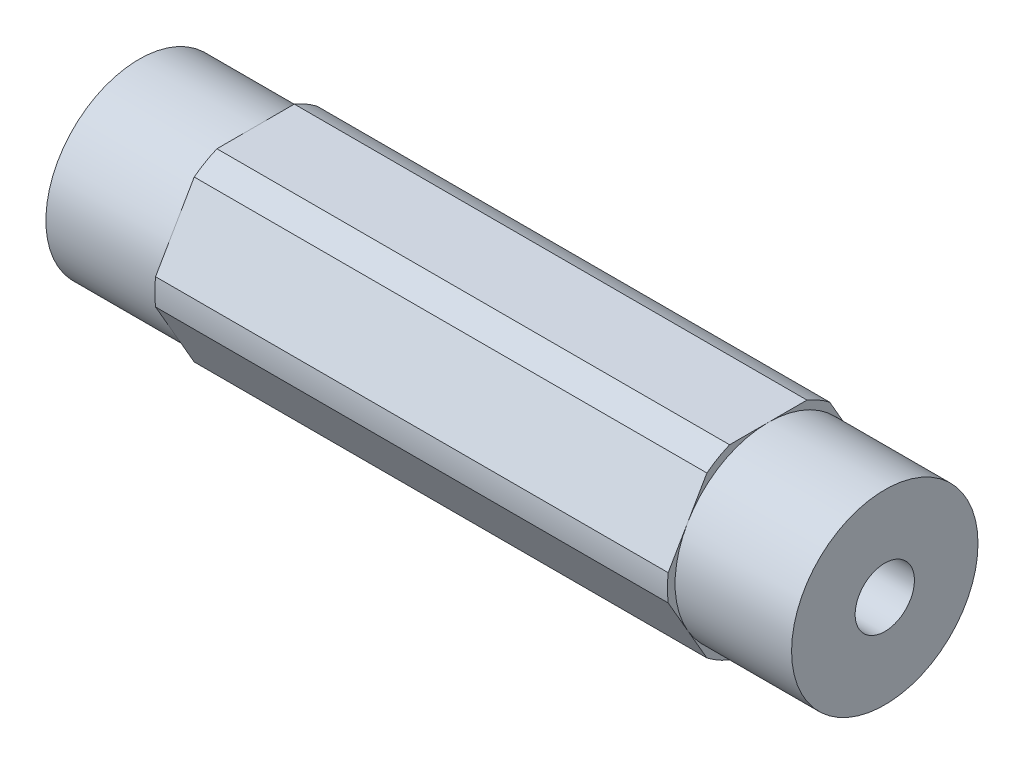
ISO-10303-21;
HEADER;
FILE_DESCRIPTION(('STEP AP214'),'2;1');
FILE_NAME('part.step','',(''),(''),'','','');
FILE_SCHEMA(('AUTOMOTIVE_DESIGN { 1 0 10303 214 1 1 1 1 }'));
ENDSEC;
DATA;
#1=APPLICATION_CONTEXT('core data for automotive mechanical design processes');
#2=APPLICATION_PROTOCOL_DEFINITION('international standard','automotive_design',2000,#1);
#3=PRODUCT_CONTEXT('',#1,'mechanical');
#4=PRODUCT('Part','Part','',(#3));
#5=PRODUCT_RELATED_PRODUCT_CATEGORY('part','',(#4));
#6=PRODUCT_DEFINITION_FORMATION('','',#4);
#7=PRODUCT_DEFINITION_CONTEXT('part definition',#1,'design');
#8=PRODUCT_DEFINITION('design','',#6,#7);
#9=PRODUCT_DEFINITION_SHAPE('','',#8);
#10=(LENGTH_UNIT() NAMED_UNIT(*) SI_UNIT(.MILLI.,.METRE.));
#11=(NAMED_UNIT(*) PLANE_ANGLE_UNIT() SI_UNIT($,.RADIAN.));
#12=(NAMED_UNIT(*) SI_UNIT($,.STERADIAN.) SOLID_ANGLE_UNIT());
#13=UNCERTAINTY_MEASURE_WITH_UNIT(LENGTH_MEASURE(1.E-05),#10,'distance_accuracy_value','');
#14=(GEOMETRIC_REPRESENTATION_CONTEXT(3) GLOBAL_UNCERTAINTY_ASSIGNED_CONTEXT((#13)) GLOBAL_UNIT_ASSIGNED_CONTEXT((#10,
#11,#12)) REPRESENTATION_CONTEXT('',''));
#15=CARTESIAN_POINT('',(0.,0.,0.));
#16=DIRECTION('',(0.,0.,1.));
#17=DIRECTION('',(1.,0.,0.));
#18=AXIS2_PLACEMENT_3D('',#15,#16,#17);
#19=CARTESIAN_POINT('',(-25.4,0.,0.));
#20=DIRECTION('',(1.,0.,0.));
#21=DIRECTION('',(0.,0.,-1.));
#22=AXIS2_PLACEMENT_3D('',#19,#20,#21);
#23=PLANE('',#22);
#24=CARTESIAN_POINT('',(-25.4,0.,0.));
#25=DIRECTION('',(1.,0.,0.));
#26=DIRECTION('',(0.,0.,-1.));
#27=AXIS2_PLACEMENT_3D('',#24,#25,#26);
#28=CIRCLE('',#27,2.0193);
#29=CARTESIAN_POINT('',(-25.4,0.,-2.0193));
#30=VERTEX_POINT('',#29);
#31=EDGE_CURVE('E251',#30,#30,#28,.T.);
#32=ORIENTED_EDGE('',*,*,#31,.T.);
#33=EDGE_LOOP('',(#32));
#34=FACE_BOUND('',#33,.T.);
#35=CARTESIAN_POINT('',(-25.4,0.,0.));
#36=DIRECTION('',(1.,0.,0.));
#37=DIRECTION('',(0.,0.,-1.));
#38=AXIS2_PLACEMENT_3D('',#35,#36,#37);
#39=CIRCLE('',#38,6.35);
#40=CARTESIAN_POINT('',(-25.4,0.,-6.35));
#41=VERTEX_POINT('',#40);
#42=EDGE_CURVE('E61',#41,#41,#39,.F.);
#43=ORIENTED_EDGE('',*,*,#42,.T.);
#44=EDGE_LOOP('',(#43));
#45=FACE_BOUND('',#44,.T.);
#46=ADVANCED_FACE('F53',(#34,#45),#23,.F.);
#47=CARTESIAN_POINT('',(25.4,3.175,-5.49926131403119));
#48=DIRECTION('',(0.,-0.5,0.866025403784438));
#49=DIRECTION('',(0.,-0.866025403784438,-0.5));
#50=AXIS2_PLACEMENT_3D('',#47,#48,#49);
#51=PLANE('',#50);
#52=DIRECTION('',(-1.,0.,0.));
#53=VECTOR('',#52,1.);
#54=CARTESIAN_POINT('',(25.4,0.893039571032185,-6.81675178197583));
#55=LINE('',#54,#53);
#56=CARTESIAN_POINT('',(17.4625,0.893039571032185,-6.81675178197583));
#57=VERTEX_POINT('',#56);
#58=CARTESIAN_POINT('',(-17.4625,0.893039571032185,-6.81675178197583));
#59=VERTEX_POINT('',#58);
#60=EDGE_CURVE('E210',#57,#59,#55,.T.);
#61=ORIENTED_EDGE('',*,*,#60,.T.);
#62=DIRECTION('',(0.,0.866025403784438,0.5));
#63=VECTOR('',#62,1.);
#64=CARTESIAN_POINT('',(-17.4625,3.175,-5.49926131403119));
#65=LINE('',#64,#63);
#66=CARTESIAN_POINT('',(-17.4625,3.175,-5.49926131403119));
#67=VERTEX_POINT('',#66);
#68=EDGE_CURVE('E68',#59,#67,#65,.T.);
#69=ORIENTED_EDGE('',*,*,#68,.T.);
#70=CARTESIAN_POINT('',(-17.4625,5.45696042896782,-4.18177084608654));
#71=VERTEX_POINT('',#70);
#72=EDGE_CURVE('E179',#67,#71,#65,.T.);
#73=ORIENTED_EDGE('',*,*,#72,.T.);
#74=DIRECTION('',(-1.,0.,0.));
#75=VECTOR('',#74,1.);
#76=CARTESIAN_POINT('',(25.4,5.45696042896782,-4.18177084608654));
#77=LINE('',#76,#75);
#78=CARTESIAN_POINT('',(17.4625,5.45696042896782,-4.18177084608654));
#79=VERTEX_POINT('',#78);
#80=EDGE_CURVE('E285',#79,#71,#77,.T.);
#81=ORIENTED_EDGE('',*,*,#80,.F.);
#82=DIRECTION('',(0.,0.866025403784438,0.5));
#83=VECTOR('',#82,1.);
#84=CARTESIAN_POINT('',(17.4625,3.175,-5.49926131403119));
#85=LINE('',#84,#83);
#86=CARTESIAN_POINT('',(17.4625,3.175,-5.49926131403119));
#87=VERTEX_POINT('',#86);
#88=EDGE_CURVE('E245',#87,#79,#85,.T.);
#89=ORIENTED_EDGE('',*,*,#88,.F.);
#90=EDGE_CURVE('E247',#57,#87,#85,.T.);
#91=ORIENTED_EDGE('',*,*,#90,.F.);
#92=EDGE_LOOP('',(#61,#69,#73,#81,#89,#91));
#93=FACE_BOUND('',#92,.T.);
#94=ADVANCED_FACE('F207',(#93),#51,.F.);
#95=CARTESIAN_POINT('',(25.4,0.,0.));
#96=DIRECTION('',(-1.,0.,0.));
#97=DIRECTION('',(0.,0.,1.));
#98=AXIS2_PLACEMENT_3D('',#95,#96,#97);
#99=CYLINDRICAL_SURFACE('',#98,6.874999966);
#100=ORIENTED_EDGE('',*,*,#80,.T.);
#101=CARTESIAN_POINT('',(-17.4625,0.,0.));
#102=DIRECTION('',(1.,0.,0.));
#103=DIRECTION('',(0.,0.,-1.));
#104=AXIS2_PLACEMENT_3D('',#101,#102,#103);
#105=CIRCLE('',#104,6.874999966);
#106=CARTESIAN_POINT('',(-17.4625,6.35,-2.63498093588929));
#107=VERTEX_POINT('',#106);
#108=EDGE_CURVE('E185',#71,#107,#105,.T.);
#109=ORIENTED_EDGE('',*,*,#108,.T.);
#110=DIRECTION('',(-1.,0.,0.));
#111=VECTOR('',#110,1.);
#112=CARTESIAN_POINT('',(25.4,6.35,-2.63498093588929));
#113=LINE('',#112,#111);
#114=CARTESIAN_POINT('',(17.4625,6.35,-2.63498093588929));
#115=VERTEX_POINT('',#114);
#116=EDGE_CURVE('E282',#115,#107,#113,.T.);
#117=ORIENTED_EDGE('',*,*,#116,.F.);
#118=CARTESIAN_POINT('',(17.4625,0.,0.));
#119=DIRECTION('',(1.,0.,0.));
#120=DIRECTION('',(0.,0.,-1.));
#121=AXIS2_PLACEMENT_3D('',#118,#119,#120);
#122=CIRCLE('',#121,6.874999966);
#123=EDGE_CURVE('E243',#79,#115,#122,.T.);
#124=ORIENTED_EDGE('',*,*,#123,.F.);
#125=EDGE_LOOP('',(#100,#109,#117,#124));
#126=FACE_BOUND('',#125,.T.);
#127=ADVANCED_FACE('F309',(#126),#99,.T.);
#128=CARTESIAN_POINT('',(25.4,6.35,0.));
#129=DIRECTION('',(0.,-1.,0.));
#130=DIRECTION('',(0.,0.,-1.));
#131=AXIS2_PLACEMENT_3D('',#128,#129,#130);
#132=PLANE('',#131);
#133=ORIENTED_EDGE('',*,*,#116,.T.);
#134=DIRECTION('',(0.,0.,1.));
#135=VECTOR('',#134,1.);
#136=CARTESIAN_POINT('',(-17.4625,6.35,0.));
#137=LINE('',#136,#135);
#138=CARTESIAN_POINT('',(-17.4625,6.35,0.));
#139=VERTEX_POINT('',#138);
#140=EDGE_CURVE('E348',#107,#139,#137,.T.);
#141=ORIENTED_EDGE('',*,*,#140,.T.);
#142=CARTESIAN_POINT('',(-17.4625,6.35,2.63498093588929));
#143=VERTEX_POINT('',#142);
#144=EDGE_CURVE('E351',#139,#143,#137,.T.);
#145=ORIENTED_EDGE('',*,*,#144,.T.);
#146=DIRECTION('',(-1.,0.,0.));
#147=VECTOR('',#146,1.);
#148=CARTESIAN_POINT('',(25.4,6.35,2.63498093588929));
#149=LINE('',#148,#147);
#150=CARTESIAN_POINT('',(17.4625,6.35,2.63498093588929));
#151=VERTEX_POINT('',#150);
#152=EDGE_CURVE('E279',#151,#143,#149,.T.);
#153=ORIENTED_EDGE('',*,*,#152,.F.);
#154=DIRECTION('',(0.,0.,1.));
#155=VECTOR('',#154,1.);
#156=CARTESIAN_POINT('',(17.4625,6.35,0.));
#157=LINE('',#156,#155);
#158=CARTESIAN_POINT('',(17.4625,6.35,0.));
#159=VERTEX_POINT('',#158);
#160=EDGE_CURVE('E240',#159,#151,#157,.T.);
#161=ORIENTED_EDGE('',*,*,#160,.F.);
#162=EDGE_CURVE('E242',#115,#159,#157,.T.);
#163=ORIENTED_EDGE('',*,*,#162,.F.);
#164=EDGE_LOOP('',(#133,#141,#145,#153,#161,#163));
#165=FACE_BOUND('',#164,.T.);
#166=ADVANCED_FACE('F316',(#165),#132,.F.);
#167=ORIENTED_EDGE('',*,*,#152,.T.);
#168=CARTESIAN_POINT('',(-17.4625,0.,0.));
#169=DIRECTION('',(1.,0.,0.));
#170=DIRECTION('',(0.,0.,-1.));
#171=AXIS2_PLACEMENT_3D('',#168,#169,#170);
#172=CIRCLE('',#171,6.874999966);
#173=CARTESIAN_POINT('',(-17.4625,5.45696042896782,4.18177084608655));
#174=VERTEX_POINT('',#173);
#175=EDGE_CURVE('E352',#143,#174,#172,.T.);
#176=ORIENTED_EDGE('',*,*,#175,.T.);
#177=DIRECTION('',(-1.,0.,0.));
#178=VECTOR('',#177,1.);
#179=CARTESIAN_POINT('',(25.4,5.45696042896782,4.18177084608655));
#180=LINE('',#179,#178);
#181=CARTESIAN_POINT('',(17.4625,5.45696042896782,4.18177084608655));
#182=VERTEX_POINT('',#181);
#183=EDGE_CURVE('E276',#182,#174,#180,.T.);
#184=ORIENTED_EDGE('',*,*,#183,.F.);
#185=CARTESIAN_POINT('',(17.4625,0.,0.));
#186=DIRECTION('',(1.,0.,0.));
#187=DIRECTION('',(0.,0.,-1.));
#188=AXIS2_PLACEMENT_3D('',#185,#186,#187);
#189=CIRCLE('',#188,6.874999966);
#190=EDGE_CURVE('E238',#151,#182,#189,.T.);
#191=ORIENTED_EDGE('',*,*,#190,.F.);
#192=EDGE_LOOP('',(#167,#176,#184,#191));
#193=FACE_BOUND('',#192,.T.);
#194=ADVANCED_FACE('F318',(#193),#99,.T.);
#195=CARTESIAN_POINT('',(25.4,3.175,5.49926131403119));
#196=DIRECTION('',(0.,-0.5,-0.866025403784439));
#197=DIRECTION('',(0.,0.866025403784439,-0.5));
#198=AXIS2_PLACEMENT_3D('',#195,#196,#197);
#199=PLANE('',#198);
#200=ORIENTED_EDGE('',*,*,#183,.T.);
#201=DIRECTION('',(0.,-0.866025403784439,0.5));
#202=VECTOR('',#201,1.);
#203=CARTESIAN_POINT('',(-17.4625,3.175,5.49926131403119));
#204=LINE('',#203,#202);
#205=CARTESIAN_POINT('',(-17.4625,3.175,5.49926131403119));
#206=VERTEX_POINT('',#205);
#207=EDGE_CURVE('E356',#174,#206,#204,.T.);
#208=ORIENTED_EDGE('',*,*,#207,.T.);
#209=CARTESIAN_POINT('',(-17.4625,0.893039571032186,6.81675178197583));
#210=VERTEX_POINT('',#209);
#211=EDGE_CURVE('E357',#206,#210,#204,.T.);
#212=ORIENTED_EDGE('',*,*,#211,.T.);
#213=DIRECTION('',(-1.,0.,0.));
#214=VECTOR('',#213,1.);
#215=CARTESIAN_POINT('',(25.4,0.893039571032186,6.81675178197583));
#216=LINE('',#215,#214);
#217=CARTESIAN_POINT('',(17.4625,0.893039571032186,6.81675178197583));
#218=VERTEX_POINT('',#217);
#219=EDGE_CURVE('E273',#218,#210,#216,.T.);
#220=ORIENTED_EDGE('',*,*,#219,.F.);
#221=DIRECTION('',(0.,-0.866025403784439,0.5));
#222=VECTOR('',#221,1.);
#223=CARTESIAN_POINT('',(17.4625,3.175,5.49926131403119));
#224=LINE('',#223,#222);
#225=CARTESIAN_POINT('',(17.4625,3.175,5.49926131403119));
#226=VERTEX_POINT('',#225);
#227=EDGE_CURVE('E235',#226,#218,#224,.T.);
#228=ORIENTED_EDGE('',*,*,#227,.F.);
#229=EDGE_CURVE('E237',#182,#226,#224,.T.);
#230=ORIENTED_EDGE('',*,*,#229,.F.);
#231=EDGE_LOOP('',(#200,#208,#212,#220,#228,#230));
#232=FACE_BOUND('',#231,.T.);
#233=ADVANCED_FACE('F335',(#232),#199,.F.);
#234=ORIENTED_EDGE('',*,*,#219,.T.);
#235=CARTESIAN_POINT('',(-17.4625,0.,0.));
#236=DIRECTION('',(1.,0.,0.));
#237=DIRECTION('',(0.,0.,-1.));
#238=AXIS2_PLACEMENT_3D('',#235,#236,#237);
#239=CIRCLE('',#238,6.874999966);
#240=CARTESIAN_POINT('',(-17.4625,-0.893039571032186,6.81675178197583));
#241=VERTEX_POINT('',#240);
#242=EDGE_CURVE('E360',#210,#241,#239,.T.);
#243=ORIENTED_EDGE('',*,*,#242,.T.);
#244=DIRECTION('',(-1.,0.,0.));
#245=VECTOR('',#244,1.);
#246=CARTESIAN_POINT('',(25.4,-0.893039571032186,6.81675178197583));
#247=LINE('',#246,#245);
#248=CARTESIAN_POINT('',(17.4625,-0.893039571032186,6.81675178197583));
#249=VERTEX_POINT('',#248);
#250=EDGE_CURVE('E270',#249,#241,#247,.T.);
#251=ORIENTED_EDGE('',*,*,#250,.F.);
#252=CARTESIAN_POINT('',(17.4625,0.,0.));
#253=DIRECTION('',(1.,0.,0.));
#254=DIRECTION('',(0.,0.,-1.));
#255=AXIS2_PLACEMENT_3D('',#252,#253,#254);
#256=CIRCLE('',#255,6.874999966);
#257=EDGE_CURVE('E233',#218,#249,#256,.T.);
#258=ORIENTED_EDGE('',*,*,#257,.F.);
#259=EDGE_LOOP('',(#234,#243,#251,#258));
#260=FACE_BOUND('',#259,.T.);
#261=ADVANCED_FACE('F333',(#260),#99,.T.);
#262=CARTESIAN_POINT('',(25.4,-3.175,5.49926131403119));
#263=DIRECTION('',(0.,0.5,-0.866025403784439));
#264=DIRECTION('',(0.,0.866025403784439,0.5));
#265=AXIS2_PLACEMENT_3D('',#262,#263,#264);
#266=PLANE('',#265);
#267=ORIENTED_EDGE('',*,*,#250,.T.);
#268=DIRECTION('',(0.,-0.866025403784439,-0.5));
#269=VECTOR('',#268,1.);
#270=CARTESIAN_POINT('',(-17.4625,-3.175,5.49926131403119));
#271=LINE('',#270,#269);
#272=CARTESIAN_POINT('',(-17.4625,-3.175,5.49926131403119));
#273=VERTEX_POINT('',#272);
#274=EDGE_CURVE('E363',#241,#273,#271,.T.);
#275=ORIENTED_EDGE('',*,*,#274,.T.);
#276=CARTESIAN_POINT('',(-17.4625,-5.45696042896782,4.18177084608654));
#277=VERTEX_POINT('',#276);
#278=EDGE_CURVE('E364',#273,#277,#271,.T.);
#279=ORIENTED_EDGE('',*,*,#278,.T.);
#280=DIRECTION('',(-1.,0.,0.));
#281=VECTOR('',#280,1.);
#282=CARTESIAN_POINT('',(25.4,-5.45696042896782,4.18177084608655));
#283=LINE('',#282,#281);
#284=CARTESIAN_POINT('',(17.4625,-5.45696042896782,4.18177084608654));
#285=VERTEX_POINT('',#284);
#286=EDGE_CURVE('E267',#285,#277,#283,.T.);
#287=ORIENTED_EDGE('',*,*,#286,.F.);
#288=DIRECTION('',(0.,-0.866025403784439,-0.5));
#289=VECTOR('',#288,1.);
#290=CARTESIAN_POINT('',(17.4625,-3.175,5.49926131403119));
#291=LINE('',#290,#289);
#292=CARTESIAN_POINT('',(17.4625,-3.175,5.49926131403119));
#293=VERTEX_POINT('',#292);
#294=EDGE_CURVE('E230',#293,#285,#291,.T.);
#295=ORIENTED_EDGE('',*,*,#294,.F.);
#296=EDGE_CURVE('E232',#249,#293,#291,.T.);
#297=ORIENTED_EDGE('',*,*,#296,.F.);
#298=EDGE_LOOP('',(#267,#275,#279,#287,#295,#297));
#299=FACE_BOUND('',#298,.T.);
#300=ADVANCED_FACE('F330',(#299),#266,.F.);
#301=ORIENTED_EDGE('',*,*,#286,.T.);
#302=CARTESIAN_POINT('',(-17.4625,0.,0.));
#303=DIRECTION('',(1.,0.,0.));
#304=DIRECTION('',(0.,0.,-1.));
#305=AXIS2_PLACEMENT_3D('',#302,#303,#304);
#306=CIRCLE('',#305,6.874999966);
#307=CARTESIAN_POINT('',(-17.4625,-6.35,2.63498093588928));
#308=VERTEX_POINT('',#307);
#309=EDGE_CURVE('E367',#277,#308,#306,.T.);
#310=ORIENTED_EDGE('',*,*,#309,.T.);
#311=DIRECTION('',(-1.,0.,0.));
#312=VECTOR('',#311,1.);
#313=CARTESIAN_POINT('',(25.4,-6.35,2.63498093588928));
#314=LINE('',#313,#312);
#315=CARTESIAN_POINT('',(17.4625,-6.35,2.63498093588928));
#316=VERTEX_POINT('',#315);
#317=EDGE_CURVE('E264',#316,#308,#314,.T.);
#318=ORIENTED_EDGE('',*,*,#317,.F.);
#319=CARTESIAN_POINT('',(17.4625,0.,0.));
#320=DIRECTION('',(1.,0.,0.));
#321=DIRECTION('',(0.,0.,-1.));
#322=AXIS2_PLACEMENT_3D('',#319,#320,#321);
#323=CIRCLE('',#322,6.874999966);
#324=EDGE_CURVE('E228',#285,#316,#323,.T.);
#325=ORIENTED_EDGE('',*,*,#324,.F.);
#326=EDGE_LOOP('',(#301,#310,#318,#325));
#327=FACE_BOUND('',#326,.T.);
#328=ADVANCED_FACE('F328',(#327),#99,.T.);
#329=CARTESIAN_POINT('',(25.4,-6.35,0.));
#330=DIRECTION('',(0.,1.,0.));
#331=DIRECTION('',(0.,0.,1.));
#332=AXIS2_PLACEMENT_3D('',#329,#330,#331);
#333=PLANE('',#332);
#334=ORIENTED_EDGE('',*,*,#317,.T.);
#335=DIRECTION('',(0.,0.,-1.));
#336=VECTOR('',#335,1.);
#337=CARTESIAN_POINT('',(-17.4625,-6.35,0.));
#338=LINE('',#337,#336);
#339=CARTESIAN_POINT('',(-17.4625,-6.35,0.));
#340=VERTEX_POINT('',#339);
#341=EDGE_CURVE('E370',#308,#340,#338,.T.);
#342=ORIENTED_EDGE('',*,*,#341,.T.);
#343=CARTESIAN_POINT('',(-17.4625,-6.35,-2.63498093588928));
#344=VERTEX_POINT('',#343);
#345=EDGE_CURVE('E371',#340,#344,#338,.T.);
#346=ORIENTED_EDGE('',*,*,#345,.T.);
#347=DIRECTION('',(-1.,0.,0.));
#348=VECTOR('',#347,1.);
#349=CARTESIAN_POINT('',(25.4,-6.35,-2.63498093588928));
#350=LINE('',#349,#348);
#351=CARTESIAN_POINT('',(17.4625,-6.35,-2.63498093588928));
#352=VERTEX_POINT('',#351);
#353=EDGE_CURVE('E261',#352,#344,#350,.T.);
#354=ORIENTED_EDGE('',*,*,#353,.F.);
#355=DIRECTION('',(0.,0.,-1.));
#356=VECTOR('',#355,1.);
#357=CARTESIAN_POINT('',(17.4625,-6.35,0.));
#358=LINE('',#357,#356);
#359=CARTESIAN_POINT('',(17.4625,-6.35,0.));
#360=VERTEX_POINT('',#359);
#361=EDGE_CURVE('E225',#360,#352,#358,.T.);
#362=ORIENTED_EDGE('',*,*,#361,.F.);
#363=EDGE_CURVE('E227',#316,#360,#358,.T.);
#364=ORIENTED_EDGE('',*,*,#363,.F.);
#365=EDGE_LOOP('',(#334,#342,#346,#354,#362,#364));
#366=FACE_BOUND('',#365,.T.);
#367=ADVANCED_FACE('F325',(#366),#333,.F.);
#368=ORIENTED_EDGE('',*,*,#353,.T.);
#369=CARTESIAN_POINT('',(-17.4625,0.,0.));
#370=DIRECTION('',(1.,0.,0.));
#371=DIRECTION('',(0.,0.,-1.));
#372=AXIS2_PLACEMENT_3D('',#369,#370,#371);
#373=CIRCLE('',#372,6.874999966);
#374=CARTESIAN_POINT('',(-17.4625,-5.45696042896782,-4.18177084608655));
#375=VERTEX_POINT('',#374);
#376=EDGE_CURVE('E374',#344,#375,#373,.T.);
#377=ORIENTED_EDGE('',*,*,#376,.T.);
#378=DIRECTION('',(-1.,0.,0.));
#379=VECTOR('',#378,1.);
#380=CARTESIAN_POINT('',(25.4,-5.45696042896782,-4.18177084608655));
#381=LINE('',#380,#379);
#382=CARTESIAN_POINT('',(17.4625,-5.45696042896782,-4.18177084608655));
#383=VERTEX_POINT('',#382);
#384=EDGE_CURVE('E258',#383,#375,#381,.T.);
#385=ORIENTED_EDGE('',*,*,#384,.F.);
#386=CARTESIAN_POINT('',(17.4625,0.,0.));
#387=DIRECTION('',(1.,0.,0.));
#388=DIRECTION('',(0.,0.,-1.));
#389=AXIS2_PLACEMENT_3D('',#386,#387,#388);
#390=CIRCLE('',#389,6.874999966);
#391=EDGE_CURVE('E223',#352,#383,#390,.T.);
#392=ORIENTED_EDGE('',*,*,#391,.F.);
#393=EDGE_LOOP('',(#368,#377,#385,#392));
#394=FACE_BOUND('',#393,.T.);
#395=ADVANCED_FACE('F323',(#394),#99,.T.);
#396=CARTESIAN_POINT('',(25.4,-3.175,-5.49926131403119));
#397=DIRECTION('',(0.,0.5,0.866025403784439));
#398=DIRECTION('',(0.,-0.866025403784439,0.5));
#399=AXIS2_PLACEMENT_3D('',#396,#397,#398);
#400=PLANE('',#399);
#401=ORIENTED_EDGE('',*,*,#384,.T.);
#402=DIRECTION('',(0.,0.866025403784439,-0.5));
#403=VECTOR('',#402,1.);
#404=CARTESIAN_POINT('',(-17.4625,-3.175,-5.49926131403119));
#405=LINE('',#404,#403);
#406=CARTESIAN_POINT('',(-17.4625,-3.175,-5.49926131403119));
#407=VERTEX_POINT('',#406);
#408=EDGE_CURVE('E377',#375,#407,#405,.T.);
#409=ORIENTED_EDGE('',*,*,#408,.T.);
#410=CARTESIAN_POINT('',(-17.4625,-0.893039571032186,-6.81675178197583));
#411=VERTEX_POINT('',#410);
#412=EDGE_CURVE('E194',#407,#411,#405,.T.);
#413=ORIENTED_EDGE('',*,*,#412,.T.);
#414=DIRECTION('',(-1.,0.,0.));
#415=VECTOR('',#414,1.);
#416=CARTESIAN_POINT('',(25.4,-0.893039571032186,-6.81675178197583));
#417=LINE('',#416,#415);
#418=CARTESIAN_POINT('',(17.4625,-0.893039571032186,-6.81675178197583));
#419=VERTEX_POINT('',#418);
#420=EDGE_CURVE('E255',#419,#411,#417,.T.);
#421=ORIENTED_EDGE('',*,*,#420,.F.);
#422=DIRECTION('',(0.,0.866025403784439,-0.5));
#423=VECTOR('',#422,1.);
#424=CARTESIAN_POINT('',(17.4625,-3.175,-5.49926131403119));
#425=LINE('',#424,#423);
#426=CARTESIAN_POINT('',(17.4625,-3.175,-5.49926131403119));
#427=VERTEX_POINT('',#426);
#428=EDGE_CURVE('E75',#427,#419,#425,.T.);
#429=ORIENTED_EDGE('',*,*,#428,.F.);
#430=EDGE_CURVE('E222',#383,#427,#425,.T.);
#431=ORIENTED_EDGE('',*,*,#430,.F.);
#432=EDGE_LOOP('',(#401,#409,#413,#421,#429,#431));
#433=FACE_BOUND('',#432,.T.);
#434=ADVANCED_FACE('F320',(#433),#400,.F.);
#435=ORIENTED_EDGE('',*,*,#420,.T.);
#436=CARTESIAN_POINT('',(-17.4625,0.,0.));
#437=DIRECTION('',(1.,0.,0.));
#438=DIRECTION('',(0.,0.,-1.));
#439=AXIS2_PLACEMENT_3D('',#436,#437,#438);
#440=CIRCLE('',#439,6.874999966);
#441=EDGE_CURVE('E12',#411,#59,#440,.T.);
#442=ORIENTED_EDGE('',*,*,#441,.T.);
#443=ORIENTED_EDGE('',*,*,#60,.F.);
#444=CARTESIAN_POINT('',(17.4625,0.,0.));
#445=DIRECTION('',(1.,0.,0.));
#446=DIRECTION('',(0.,0.,-1.));
#447=AXIS2_PLACEMENT_3D('',#444,#445,#446);
#448=CIRCLE('',#447,6.874999966);
#449=EDGE_CURVE('E290',#419,#57,#448,.T.);
#450=ORIENTED_EDGE('',*,*,#449,.F.);
#451=EDGE_LOOP('',(#435,#442,#443,#450));
#452=FACE_BOUND('',#451,.T.);
#453=ADVANCED_FACE('F319',(#452),#99,.T.);
#454=CARTESIAN_POINT('',(25.4,0.,0.));
#455=DIRECTION('',(1.,0.,0.));
#456=DIRECTION('',(0.,0.,-1.));
#457=AXIS2_PLACEMENT_3D('',#454,#455,#456);
#458=PLANE('',#457);
#459=CARTESIAN_POINT('',(25.4,0.,0.));
#460=DIRECTION('',(1.,0.,0.));
#461=DIRECTION('',(0.,0.,-1.));
#462=AXIS2_PLACEMENT_3D('',#459,#460,#461);
#463=CIRCLE('',#462,2.0193);
#464=CARTESIAN_POINT('',(25.4,0.,-2.0193));
#465=VERTEX_POINT('',#464);
#466=EDGE_CURVE('E248',#465,#465,#463,.T.);
#467=ORIENTED_EDGE('',*,*,#466,.F.);
#468=EDGE_LOOP('',(#467));
#469=FACE_BOUND('',#468,.T.);
#470=CARTESIAN_POINT('',(25.4,0.,0.));
#471=DIRECTION('',(1.,0.,0.));
#472=DIRECTION('',(0.,0.,-1.));
#473=AXIS2_PLACEMENT_3D('',#470,#471,#472);
#474=CIRCLE('',#473,6.35);
#475=CARTESIAN_POINT('',(25.4,0.,-6.35));
#476=VERTEX_POINT('',#475);
#477=EDGE_CURVE('E287',#476,#476,#474,.T.);
#478=ORIENTED_EDGE('',*,*,#477,.T.);
#479=EDGE_LOOP('',(#478));
#480=FACE_BOUND('',#479,.T.);
#481=ADVANCED_FACE('F312',(#469,#480),#458,.T.);
#482=CARTESIAN_POINT('',(25.4,0.,0.));
#483=DIRECTION('',(-1.,0.,0.));
#484=DIRECTION('',(0.,0.,1.));
#485=AXIS2_PLACEMENT_3D('',#482,#483,#484);
#486=CYLINDRICAL_SURFACE('',#485,2.0193);
#487=ORIENTED_EDGE('',*,*,#466,.T.);
#488=EDGE_LOOP('',(#487));
#489=FACE_BOUND('',#488,.T.);
#490=ORIENTED_EDGE('',*,*,#31,.F.);
#491=EDGE_LOOP('',(#490));
#492=FACE_BOUND('',#491,.T.);
#493=ADVANCED_FACE('F55',(#489,#492),#486,.F.);
#494=CARTESIAN_POINT('',(17.4625,0.,0.));
#495=DIRECTION('',(1.,0.,0.));
#496=DIRECTION('',(0.,0.,-1.));
#497=AXIS2_PLACEMENT_3D('',#494,#495,#496);
#498=PLANE('',#497);
#499=ORIENTED_EDGE('',*,*,#90,.T.);
#500=CARTESIAN_POINT('',(17.4625,0.,0.));
#501=DIRECTION('',(1.,0.,0.));
#502=DIRECTION('',(0.,0.,-1.));
#503=AXIS2_PLACEMENT_3D('',#500,#501,#502);
#504=CIRCLE('',#503,6.35);
#505=EDGE_CURVE('E211',#427,#87,#504,.T.);
#506=ORIENTED_EDGE('',*,*,#505,.F.);
#507=ORIENTED_EDGE('',*,*,#428,.T.);
#508=ORIENTED_EDGE('',*,*,#449,.T.);
#509=EDGE_LOOP('',(#499,#506,#507,#508));
#510=FACE_BOUND('',#509,.T.);
#511=ADVANCED_FACE('F424',(#510),#498,.T.);
#512=ORIENTED_EDGE('',*,*,#88,.T.);
#513=ORIENTED_EDGE('',*,*,#123,.T.);
#514=ORIENTED_EDGE('',*,*,#162,.T.);
#515=EDGE_CURVE('E215',#87,#159,#504,.T.);
#516=ORIENTED_EDGE('',*,*,#515,.F.);
#517=EDGE_LOOP('',(#512,#513,#514,#516));
#518=FACE_BOUND('',#517,.T.);
#519=ADVANCED_FACE('F418',(#518),#498,.T.);
#520=ORIENTED_EDGE('',*,*,#160,.T.);
#521=ORIENTED_EDGE('',*,*,#190,.T.);
#522=ORIENTED_EDGE('',*,*,#229,.T.);
#523=EDGE_CURVE('E220',#159,#226,#504,.T.);
#524=ORIENTED_EDGE('',*,*,#523,.F.);
#525=EDGE_LOOP('',(#520,#521,#522,#524));
#526=FACE_BOUND('',#525,.T.);
#527=ADVANCED_FACE('F407',(#526),#498,.T.);
#528=ORIENTED_EDGE('',*,*,#227,.T.);
#529=ORIENTED_EDGE('',*,*,#257,.T.);
#530=ORIENTED_EDGE('',*,*,#296,.T.);
#531=EDGE_CURVE('E412',#226,#293,#504,.T.);
#532=ORIENTED_EDGE('',*,*,#531,.F.);
#533=EDGE_LOOP('',(#528,#529,#530,#532));
#534=FACE_BOUND('',#533,.T.);
#535=ADVANCED_FACE('F440',(#534),#498,.T.);
#536=ORIENTED_EDGE('',*,*,#294,.T.);
#537=ORIENTED_EDGE('',*,*,#324,.T.);
#538=ORIENTED_EDGE('',*,*,#363,.T.);
#539=EDGE_CURVE('E426',#293,#360,#504,.T.);
#540=ORIENTED_EDGE('',*,*,#539,.F.);
#541=EDGE_LOOP('',(#536,#537,#538,#540));
#542=FACE_BOUND('',#541,.T.);
#543=ADVANCED_FACE('F434',(#542),#498,.T.);
#544=ORIENTED_EDGE('',*,*,#361,.T.);
#545=ORIENTED_EDGE('',*,*,#391,.T.);
#546=ORIENTED_EDGE('',*,*,#430,.T.);
#547=EDGE_CURVE('E213',#360,#427,#504,.T.);
#548=ORIENTED_EDGE('',*,*,#547,.F.);
#549=EDGE_LOOP('',(#544,#545,#546,#548));
#550=FACE_BOUND('',#549,.T.);
#551=ADVANCED_FACE('F422',(#550),#498,.T.);
#552=CARTESIAN_POINT('',(17.4625,0.,0.));
#553=DIRECTION('',(1.,0.,0.));
#554=DIRECTION('',(0.,0.,-1.));
#555=AXIS2_PLACEMENT_3D('',#552,#553,#554);
#556=CYLINDRICAL_SURFACE('',#555,6.35);
#557=ORIENTED_EDGE('',*,*,#477,.F.);
#558=EDGE_LOOP('',(#557));
#559=FACE_BOUND('',#558,.T.);
#560=ORIENTED_EDGE('',*,*,#505,.T.);
#561=ORIENTED_EDGE('',*,*,#515,.T.);
#562=ORIENTED_EDGE('',*,*,#523,.T.);
#563=ORIENTED_EDGE('',*,*,#531,.T.);
#564=ORIENTED_EDGE('',*,*,#539,.T.);
#565=ORIENTED_EDGE('',*,*,#547,.T.);
#566=EDGE_LOOP('',(#560,#561,#562,#563,#564,#565));
#567=FACE_BOUND('',#566,.T.);
#568=ADVANCED_FACE('F414',(#559,#567),#556,.T.);
#569=CARTESIAN_POINT('',(-17.4625,0.,0.));
#570=DIRECTION('',(1.,0.,0.));
#571=DIRECTION('',(0.,0.,-1.));
#572=AXIS2_PLACEMENT_3D('',#569,#570,#571);
#573=PLANE('',#572);
#574=ORIENTED_EDGE('',*,*,#441,.F.);
#575=ORIENTED_EDGE('',*,*,#412,.F.);
#576=CARTESIAN_POINT('',(-17.4625,0.,0.));
#577=DIRECTION('',(1.,0.,0.));
#578=DIRECTION('',(0.,0.,-1.));
#579=AXIS2_PLACEMENT_3D('',#576,#577,#578);
#580=CIRCLE('',#579,6.35);
#581=EDGE_CURVE('E191',#407,#67,#580,.T.);
#582=ORIENTED_EDGE('',*,*,#581,.T.);
#583=ORIENTED_EDGE('',*,*,#68,.F.);
#584=EDGE_LOOP('',(#574,#575,#582,#583));
#585=FACE_BOUND('',#584,.T.);
#586=ADVANCED_FACE('F192',(#585),#573,.F.);
#587=EDGE_CURVE('E182',#67,#139,#580,.T.);
#588=ORIENTED_EDGE('',*,*,#587,.T.);
#589=ORIENTED_EDGE('',*,*,#140,.F.);
#590=ORIENTED_EDGE('',*,*,#108,.F.);
#591=ORIENTED_EDGE('',*,*,#72,.F.);
#592=EDGE_LOOP('',(#588,#589,#590,#591));
#593=FACE_BOUND('',#592,.T.);
#594=ADVANCED_FACE('F180',(#593),#573,.F.);
#595=EDGE_CURVE('E205',#139,#206,#580,.T.);
#596=ORIENTED_EDGE('',*,*,#595,.T.);
#597=ORIENTED_EDGE('',*,*,#207,.F.);
#598=ORIENTED_EDGE('',*,*,#175,.F.);
#599=ORIENTED_EDGE('',*,*,#144,.F.);
#600=EDGE_LOOP('',(#596,#597,#598,#599));
#601=FACE_BOUND('',#600,.T.);
#602=ADVANCED_FACE('F398',(#601),#573,.F.);
#603=EDGE_CURVE('E393',#206,#273,#580,.T.);
#604=ORIENTED_EDGE('',*,*,#603,.T.);
#605=ORIENTED_EDGE('',*,*,#274,.F.);
#606=ORIENTED_EDGE('',*,*,#242,.F.);
#607=ORIENTED_EDGE('',*,*,#211,.F.);
#608=EDGE_LOOP('',(#604,#605,#606,#607));
#609=FACE_BOUND('',#608,.T.);
#610=ADVANCED_FACE('F437',(#609),#573,.F.);
#611=EDGE_CURVE('E390',#273,#340,#580,.T.);
#612=ORIENTED_EDGE('',*,*,#611,.T.);
#613=ORIENTED_EDGE('',*,*,#341,.F.);
#614=ORIENTED_EDGE('',*,*,#309,.F.);
#615=ORIENTED_EDGE('',*,*,#278,.F.);
#616=EDGE_LOOP('',(#612,#613,#614,#615));
#617=FACE_BOUND('',#616,.T.);
#618=ADVANCED_FACE('F300',(#617),#573,.F.);
#619=EDGE_CURVE('E198',#340,#407,#580,.T.);
#620=ORIENTED_EDGE('',*,*,#619,.T.);
#621=ORIENTED_EDGE('',*,*,#408,.F.);
#622=ORIENTED_EDGE('',*,*,#376,.F.);
#623=ORIENTED_EDGE('',*,*,#345,.F.);
#624=EDGE_LOOP('',(#620,#621,#622,#623));
#625=FACE_BOUND('',#624,.T.);
#626=ADVANCED_FACE('F295',(#625),#573,.F.);
#627=CARTESIAN_POINT('',(-17.4625,0.,0.));
#628=DIRECTION('',(-1.,0.,0.));
#629=DIRECTION('',(0.,0.,1.));
#630=AXIS2_PLACEMENT_3D('',#627,#628,#629);
#631=CYLINDRICAL_SURFACE('',#630,6.35);
#632=ORIENTED_EDGE('',*,*,#587,.F.);
#633=ORIENTED_EDGE('',*,*,#581,.F.);
#634=ORIENTED_EDGE('',*,*,#619,.F.);
#635=ORIENTED_EDGE('',*,*,#611,.F.);
#636=ORIENTED_EDGE('',*,*,#603,.F.);
#637=ORIENTED_EDGE('',*,*,#595,.F.);
#638=EDGE_LOOP('',(#632,#633,#634,#635,#636,#637));
#639=FACE_BOUND('',#638,.T.);
#640=ORIENTED_EDGE('',*,*,#42,.F.);
#641=EDGE_LOOP('',(#640));
#642=FACE_BOUND('',#641,.T.);
#643=ADVANCED_FACE('F201',(#639,#642),#631,.T.);
#644=CLOSED_SHELL('',(#46,#94,#127,#166,#194,#233,#261,#300,#328,#367,#395,#434,#453,#481,#493,
#511,#519,#527,#535,#543,#551,#568,#586,#594,#602,#610,#618,#626,#643));
#645=MANIFOLD_SOLID_BREP('B2',#644);
#646=ADVANCED_BREP_SHAPE_REPRESENTATION('',(#18,#645),#14);
#647=SHAPE_DEFINITION_REPRESENTATION(#9,#646);
ENDSEC;
END-ISO-10303-21;
